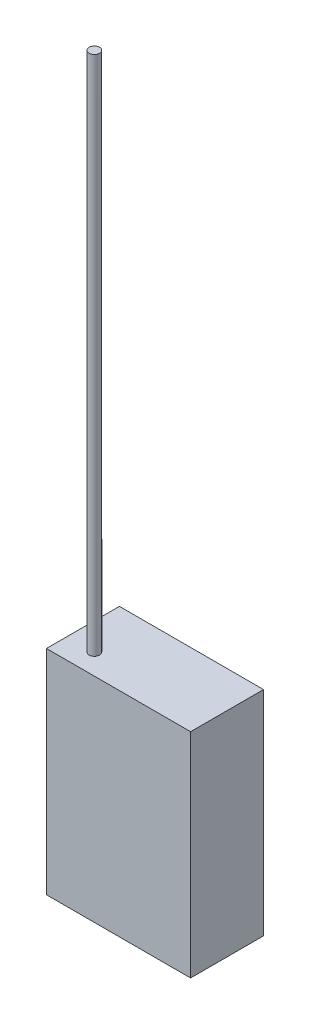
ISO-10303-21;
HEADER;
FILE_DESCRIPTION(('STEP AP214'),'2;1');
FILE_NAME('part.step','',(''),(''),'','','');
FILE_SCHEMA(('AUTOMOTIVE_DESIGN { 1 0 10303 214 1 1 1 1 }'));
ENDSEC;
DATA;
#1=APPLICATION_CONTEXT('core data for automotive mechanical design processes');
#2=APPLICATION_PROTOCOL_DEFINITION('international standard','automotive_design',2000,#1);
#3=PRODUCT_CONTEXT('',#1,'mechanical');
#4=PRODUCT('Part','Part','',(#3));
#5=PRODUCT_RELATED_PRODUCT_CATEGORY('part','',(#4));
#6=PRODUCT_DEFINITION_FORMATION('','',#4);
#7=PRODUCT_DEFINITION_CONTEXT('part definition',#1,'design');
#8=PRODUCT_DEFINITION('design','',#6,#7);
#9=PRODUCT_DEFINITION_SHAPE('','',#8);
#10=(LENGTH_UNIT() NAMED_UNIT(*) SI_UNIT(.MILLI.,.METRE.));
#11=(NAMED_UNIT(*) PLANE_ANGLE_UNIT() SI_UNIT($,.RADIAN.));
#12=(NAMED_UNIT(*) SI_UNIT($,.STERADIAN.) SOLID_ANGLE_UNIT());
#13=UNCERTAINTY_MEASURE_WITH_UNIT(LENGTH_MEASURE(1.E-05),#10,'distance_accuracy_value','');
#14=(GEOMETRIC_REPRESENTATION_CONTEXT(3) GLOBAL_UNCERTAINTY_ASSIGNED_CONTEXT((#13)) GLOBAL_UNIT_ASSIGNED_CONTEXT((#10,
#11,#12)) REPRESENTATION_CONTEXT('',''));
#15=CARTESIAN_POINT('',(0.,0.,0.));
#16=DIRECTION('',(0.,0.,1.));
#17=DIRECTION('',(1.,0.,0.));
#18=AXIS2_PLACEMENT_3D('',#15,#16,#17);
#19=CARTESIAN_POINT('',(-63.0073106843084,12.0199431125403,7.));
#20=DIRECTION('',(1.,0.,0.));
#21=DIRECTION('',(0.,0.,-1.));
#22=AXIS2_PLACEMENT_3D('',#19,#20,#21);
#23=PLANE('',#22);
#24=DIRECTION('',(0.,-1.,0.));
#25=VECTOR('',#24,1.);
#26=CARTESIAN_POINT('',(-63.0073106843084,12.0199431125403,0.));
#27=LINE('',#26,#25);
#28=CARTESIAN_POINT('',(-63.0073106843084,12.0199431125403,0.));
#29=VERTEX_POINT('',#28);
#30=CARTESIAN_POINT('',(-63.0073106843084,-8.44386503348522,0.));
#31=VERTEX_POINT('',#30);
#32=EDGE_CURVE('E98',#29,#31,#27,.T.);
#33=ORIENTED_EDGE('',*,*,#32,.T.);
#34=DIRECTION('',(0.,0.,-1.));
#35=VECTOR('',#34,1.);
#36=CARTESIAN_POINT('',(-63.0073106843084,-8.44386503348522,7.));
#37=LINE('',#36,#35);
#38=CARTESIAN_POINT('',(-63.0073106843084,-8.44386503348522,7.));
#39=VERTEX_POINT('',#38);
#40=EDGE_CURVE('E40',#39,#31,#37,.T.);
#41=ORIENTED_EDGE('',*,*,#40,.F.);
#42=DIRECTION('',(0.,-1.,0.));
#43=VECTOR('',#42,1.);
#44=CARTESIAN_POINT('',(-63.0073106843084,12.0199431125403,7.));
#45=LINE('',#44,#43);
#46=CARTESIAN_POINT('',(-63.0073106843084,12.0199431125403,7.));
#47=VERTEX_POINT('',#46);
#48=EDGE_CURVE('E84',#47,#39,#45,.T.);
#49=ORIENTED_EDGE('',*,*,#48,.F.);
#50=DIRECTION('',(0.,0.,-1.));
#51=VECTOR('',#50,1.);
#52=CARTESIAN_POINT('',(-63.0073106843084,12.0199431125403,7.));
#53=LINE('',#52,#51);
#54=EDGE_CURVE('E94',#47,#29,#53,.T.);
#55=ORIENTED_EDGE('',*,*,#54,.T.);
#56=EDGE_LOOP('',(#33,#41,#49,#55));
#57=FACE_BOUND('',#56,.T.);
#58=ADVANCED_FACE('F32',(#57),#23,.F.);
#59=CARTESIAN_POINT('',(-63.0073106843084,-8.44386503348522,7.));
#60=DIRECTION('',(0.,1.,0.));
#61=DIRECTION('',(0.,0.,1.));
#62=AXIS2_PLACEMENT_3D('',#59,#60,#61);
#63=PLANE('',#62);
#64=DIRECTION('',(1.,0.,0.));
#65=VECTOR('',#64,1.);
#66=CARTESIAN_POINT('',(-63.0073106843084,-8.44386503348522,0.));
#67=LINE('',#66,#65);
#68=CARTESIAN_POINT('',(-49.1804132883452,-8.44386503348522,0.));
#69=VERTEX_POINT('',#68);
#70=EDGE_CURVE('E89',#31,#69,#67,.T.);
#71=ORIENTED_EDGE('',*,*,#70,.T.);
#72=DIRECTION('',(0.,0.,-1.));
#73=VECTOR('',#72,1.);
#74=CARTESIAN_POINT('',(-49.1804132883452,-8.44386503348522,7.));
#75=LINE('',#74,#73);
#76=CARTESIAN_POINT('',(-49.1804132883452,-8.44386503348522,7.));
#77=VERTEX_POINT('',#76);
#78=EDGE_CURVE('E87',#77,#69,#75,.T.);
#79=ORIENTED_EDGE('',*,*,#78,.F.);
#80=DIRECTION('',(1.,0.,0.));
#81=VECTOR('',#80,1.);
#82=CARTESIAN_POINT('',(-63.0073106843084,-8.44386503348522,7.));
#83=LINE('',#82,#81);
#84=EDGE_CURVE('E79',#39,#77,#83,.T.);
#85=ORIENTED_EDGE('',*,*,#84,.F.);
#86=ORIENTED_EDGE('',*,*,#40,.T.);
#87=EDGE_LOOP('',(#71,#79,#85,#86));
#88=FACE_BOUND('',#87,.T.);
#89=ADVANCED_FACE('F88',(#88),#63,.F.);
#90=CARTESIAN_POINT('',(-49.1804132883452,12.0199431125403,7.));
#91=DIRECTION('',(-1.,0.,0.));
#92=DIRECTION('',(0.,0.,1.));
#93=AXIS2_PLACEMENT_3D('',#90,#91,#92);
#94=PLANE('',#93);
#95=DIRECTION('',(0.,1.,0.));
#96=VECTOR('',#95,1.);
#97=CARTESIAN_POINT('',(-49.1804132883452,12.0199431125403,0.));
#98=LINE('',#97,#96);
#99=CARTESIAN_POINT('',(-49.1804132883452,12.0199431125403,0.));
#100=VERTEX_POINT('',#99);
#101=EDGE_CURVE('E65',#69,#100,#98,.T.);
#102=ORIENTED_EDGE('',*,*,#101,.T.);
#103=DIRECTION('',(0.,0.,-1.));
#104=VECTOR('',#103,1.);
#105=CARTESIAN_POINT('',(-49.1804132883452,12.0199431125403,7.));
#106=LINE('',#105,#104);
#107=CARTESIAN_POINT('',(-49.1804132883452,12.0199431125403,7.));
#108=VERTEX_POINT('',#107);
#109=EDGE_CURVE('E90',#108,#100,#106,.T.);
#110=ORIENTED_EDGE('',*,*,#109,.F.);
#111=DIRECTION('',(0.,1.,0.));
#112=VECTOR('',#111,1.);
#113=CARTESIAN_POINT('',(-49.1804132883452,12.0199431125403,7.));
#114=LINE('',#113,#112);
#115=EDGE_CURVE('E82',#77,#108,#114,.T.);
#116=ORIENTED_EDGE('',*,*,#115,.F.);
#117=ORIENTED_EDGE('',*,*,#78,.T.);
#118=EDGE_LOOP('',(#102,#110,#116,#117));
#119=FACE_BOUND('',#118,.T.);
#120=ADVANCED_FACE('F92',(#119),#94,.F.);
#121=CARTESIAN_POINT('',(-63.0073106843084,12.0199431125403,7.));
#122=DIRECTION('',(0.,-1.,0.));
#123=DIRECTION('',(0.,0.,-1.));
#124=AXIS2_PLACEMENT_3D('',#121,#122,#123);
#125=PLANE('',#124);
#126=CARTESIAN_POINT('',(-60.4085348049053,12.0199431125403,4.99999999999994));
#127=DIRECTION('',(0.,-1.,0.));
#128=DIRECTION('',(0.,0.,-1.));
#129=AXIS2_PLACEMENT_3D('',#126,#127,#128);
#130=CIRCLE('',#129,0.499999999999999);
#131=CARTESIAN_POINT('',(-60.4085348049053,12.0199431125403,4.49999999999994));
#132=VERTEX_POINT('',#131);
#133=EDGE_CURVE('E11',#132,#132,#130,.F.);
#134=ORIENTED_EDGE('',*,*,#133,.F.);
#135=EDGE_LOOP('',(#134));
#136=FACE_BOUND('',#135,.T.);
#137=DIRECTION('',(-1.,0.,0.));
#138=VECTOR('',#137,1.);
#139=CARTESIAN_POINT('',(-63.0073106843084,12.0199431125403,0.));
#140=LINE('',#139,#138);
#141=EDGE_CURVE('E71',#100,#29,#140,.T.);
#142=ORIENTED_EDGE('',*,*,#141,.T.);
#143=ORIENTED_EDGE('',*,*,#54,.F.);
#144=DIRECTION('',(-1.,0.,0.));
#145=VECTOR('',#144,1.);
#146=CARTESIAN_POINT('',(-63.0073106843084,12.0199431125403,7.));
#147=LINE('',#146,#145);
#148=EDGE_CURVE('E48',#108,#47,#147,.T.);
#149=ORIENTED_EDGE('',*,*,#148,.F.);
#150=ORIENTED_EDGE('',*,*,#109,.T.);
#151=EDGE_LOOP('',(#142,#143,#149,#150));
#152=FACE_BOUND('',#151,.T.);
#153=ADVANCED_FACE('F120',(#136,#152),#125,.F.);
#154=CARTESIAN_POINT('',(0.,0.,7.));
#155=DIRECTION('',(0.,0.,1.));
#156=DIRECTION('',(1.,0.,0.));
#157=AXIS2_PLACEMENT_3D('',#154,#155,#156);
#158=PLANE('',#157);
#159=ORIENTED_EDGE('',*,*,#48,.T.);
#160=ORIENTED_EDGE('',*,*,#84,.T.);
#161=ORIENTED_EDGE('',*,*,#115,.T.);
#162=ORIENTED_EDGE('',*,*,#148,.T.);
#163=EDGE_LOOP('',(#159,#160,#161,#162));
#164=FACE_BOUND('',#163,.T.);
#165=ADVANCED_FACE('F80',(#164),#158,.T.);
#166=CARTESIAN_POINT('',(0.,0.,0.));
#167=DIRECTION('',(0.,0.,1.));
#168=DIRECTION('',(1.,0.,0.));
#169=AXIS2_PLACEMENT_3D('',#166,#167,#168);
#170=PLANE('',#169);
#171=ORIENTED_EDGE('',*,*,#32,.F.);
#172=ORIENTED_EDGE('',*,*,#141,.F.);
#173=ORIENTED_EDGE('',*,*,#101,.F.);
#174=ORIENTED_EDGE('',*,*,#70,.F.);
#175=EDGE_LOOP('',(#171,#172,#173,#174));
#176=FACE_BOUND('',#175,.T.);
#177=ADVANCED_FACE('F109',(#176),#170,.F.);
#178=CARTESIAN_POINT('',(-60.4085348049053,62.0199431125403,4.99999999999994));
#179=DIRECTION('',(0.,-1.,0.));
#180=DIRECTION('',(0.,0.,-1.));
#181=AXIS2_PLACEMENT_3D('',#178,#179,#180);
#182=CYLINDRICAL_SURFACE('',#181,0.499999999999999);
#183=CARTESIAN_POINT('',(-60.4085348049053,62.0199431125403,4.99999999999994));
#184=DIRECTION('',(0.,1.,0.));
#185=DIRECTION('',(0.,0.,1.));
#186=AXIS2_PLACEMENT_3D('',#183,#184,#185);
#187=CIRCLE('',#186,0.499999999999999);
#188=CARTESIAN_POINT('',(-60.4085348049053,62.0199431125403,5.49999999999994));
#189=VERTEX_POINT('',#188);
#190=EDGE_CURVE('E101',#189,#189,#187,.T.);
#191=ORIENTED_EDGE('',*,*,#190,.F.);
#192=EDGE_LOOP('',(#191));
#193=FACE_BOUND('',#192,.T.);
#194=ORIENTED_EDGE('',*,*,#133,.T.);
#195=EDGE_LOOP('',(#194));
#196=FACE_BOUND('',#195,.T.);
#197=ADVANCED_FACE('F111',(#193,#196),#182,.T.);
#198=CARTESIAN_POINT('',(-60.4085348049053,62.0199431125403,4.99999999999994));
#199=DIRECTION('',(0.,1.,0.));
#200=DIRECTION('',(0.,0.,1.));
#201=AXIS2_PLACEMENT_3D('',#198,#199,#200);
#202=PLANE('',#201);
#203=ORIENTED_EDGE('',*,*,#190,.T.);
#204=EDGE_LOOP('',(#203));
#205=FACE_BOUND('',#204,.T.);
#206=ADVANCED_FACE('F117',(#205),#202,.T.);
#207=CLOSED_SHELL('',(#58,#89,#120,#153,#165,#177,#197,#206));
#208=MANIFOLD_SOLID_BREP('B2',#207);
#209=ADVANCED_BREP_SHAPE_REPRESENTATION('',(#18,#208),#14);
#210=SHAPE_DEFINITION_REPRESENTATION(#9,#209);
ENDSEC;
END-ISO-10303-21;
